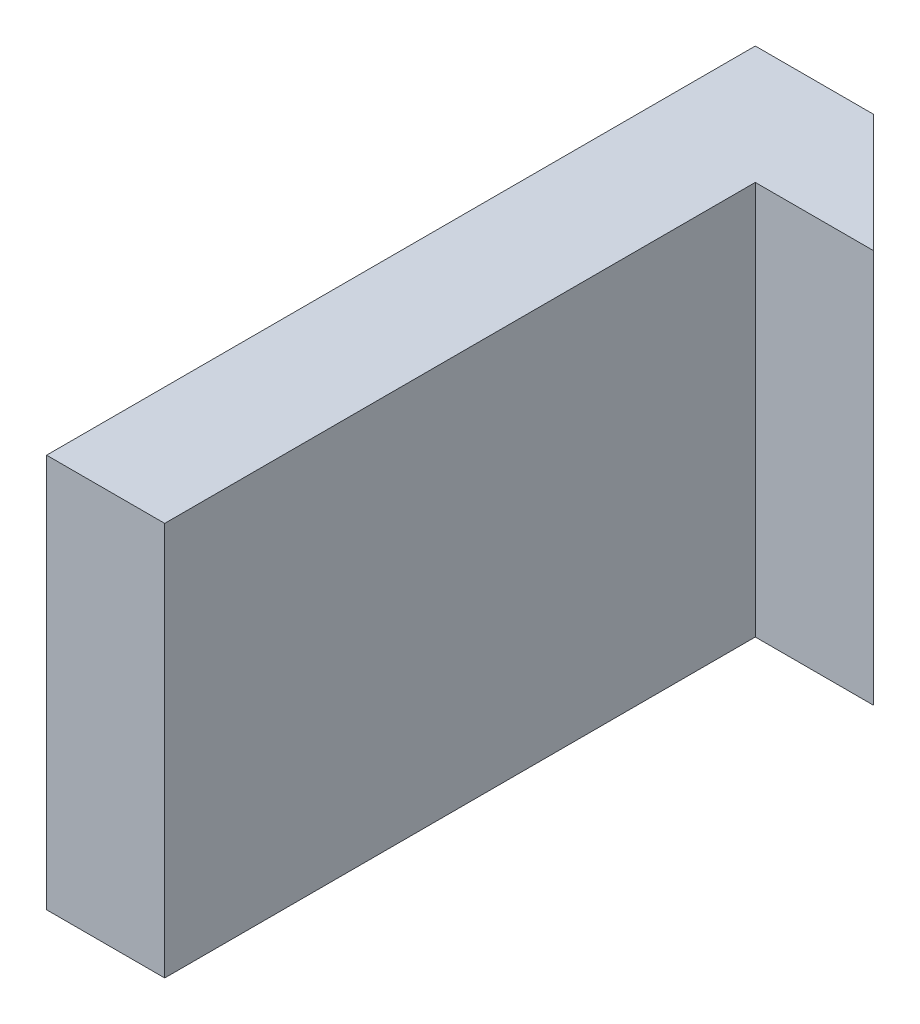
ISO-10303-21;
HEADER;
FILE_DESCRIPTION(('STEP AP214'),'2;1');
FILE_NAME('part.step','',(''),(''),'','','');
FILE_SCHEMA(('AUTOMOTIVE_DESIGN { 1 0 10303 214 1 1 1 1 }'));
ENDSEC;
DATA;
#1=APPLICATION_CONTEXT('core data for automotive mechanical design processes');
#2=APPLICATION_PROTOCOL_DEFINITION('international standard','automotive_design',2000,#1);
#3=PRODUCT_CONTEXT('',#1,'mechanical');
#4=PRODUCT('Part','Part','',(#3));
#5=PRODUCT_RELATED_PRODUCT_CATEGORY('part','',(#4));
#6=PRODUCT_DEFINITION_FORMATION('','',#4);
#7=PRODUCT_DEFINITION_CONTEXT('part definition',#1,'design');
#8=PRODUCT_DEFINITION('design','',#6,#7);
#9=PRODUCT_DEFINITION_SHAPE('','',#8);
#10=(LENGTH_UNIT() NAMED_UNIT(*) SI_UNIT(.MILLI.,.METRE.));
#11=(NAMED_UNIT(*) PLANE_ANGLE_UNIT() SI_UNIT($,.RADIAN.));
#12=(NAMED_UNIT(*) SI_UNIT($,.STERADIAN.) SOLID_ANGLE_UNIT());
#13=UNCERTAINTY_MEASURE_WITH_UNIT(LENGTH_MEASURE(1.E-05),#10,'distance_accuracy_value','');
#14=(GEOMETRIC_REPRESENTATION_CONTEXT(3) GLOBAL_UNCERTAINTY_ASSIGNED_CONTEXT((#13)) GLOBAL_UNIT_ASSIGNED_CONTEXT((#10,
#11,#12)) REPRESENTATION_CONTEXT('',''));
#15=CARTESIAN_POINT('',(0.,0.,0.));
#16=DIRECTION('',(0.,0.,1.));
#17=DIRECTION('',(1.,0.,0.));
#18=AXIS2_PLACEMENT_3D('',#15,#16,#17);
#19=CARTESIAN_POINT('',(0.75,5.,0.));
#20=DIRECTION('',(1.,0.,0.));
#21=DIRECTION('',(0.,0.,-1.));
#22=AXIS2_PLACEMENT_3D('',#19,#20,#21);
#23=PLANE('',#22);
#24=DIRECTION('',(0.,0.,1.));
#25=VECTOR('',#24,1.);
#26=CARTESIAN_POINT('',(0.75,0.,0.));
#27=LINE('',#26,#25);
#28=CARTESIAN_POINT('',(0.749999999999999,0.,-6.));
#29=VERTEX_POINT('',#28);
#30=CARTESIAN_POINT('',(0.75,0.,1.5));
#31=VERTEX_POINT('',#30);
#32=EDGE_CURVE('E115',#29,#31,#27,.T.);
#33=ORIENTED_EDGE('',*,*,#32,.F.);
#34=DIRECTION('',(0.,-1.,0.));
#35=VECTOR('',#34,1.);
#36=CARTESIAN_POINT('',(0.749999999999999,5.,-6.));
#37=LINE('',#36,#35);
#38=CARTESIAN_POINT('',(0.749999999999999,5.,-6.));
#39=VERTEX_POINT('',#38);
#40=EDGE_CURVE('E11',#39,#29,#37,.T.);
#41=ORIENTED_EDGE('',*,*,#40,.F.);
#42=DIRECTION('',(0.,0.,1.));
#43=VECTOR('',#42,1.);
#44=CARTESIAN_POINT('',(0.75,5.,0.));
#45=LINE('',#44,#43);
#46=CARTESIAN_POINT('',(0.75,5.,1.5));
#47=VERTEX_POINT('',#46);
#48=EDGE_CURVE('E127',#39,#47,#45,.T.);
#49=ORIENTED_EDGE('',*,*,#48,.T.);
#50=DIRECTION('',(0.,-1.,0.));
#51=VECTOR('',#50,1.);
#52=CARTESIAN_POINT('',(0.75,5.,1.5));
#53=LINE('',#52,#51);
#54=EDGE_CURVE('E77',#47,#31,#53,.T.);
#55=ORIENTED_EDGE('',*,*,#54,.T.);
#56=EDGE_LOOP('',(#33,#41,#49,#55));
#57=FACE_BOUND('',#56,.T.);
#58=ADVANCED_FACE('F33',(#57),#23,.T.);
#59=CARTESIAN_POINT('',(0.,5.,-6.));
#60=DIRECTION('',(0.,0.,-1.));
#61=DIRECTION('',(-1.,0.,0.));
#62=AXIS2_PLACEMENT_3D('',#59,#60,#61);
#63=PLANE('',#62);
#64=DIRECTION('',(1.,0.,0.));
#65=VECTOR('',#64,1.);
#66=CARTESIAN_POINT('',(0.,0.,-6.));
#67=LINE('',#66,#65);
#68=CARTESIAN_POINT('',(2.25,0.,-6.));
#69=VERTEX_POINT('',#68);
#70=EDGE_CURVE('E118',#29,#69,#67,.T.);
#71=ORIENTED_EDGE('',*,*,#70,.T.);
#72=DIRECTION('',(0.,-1.,0.));
#73=VECTOR('',#72,1.);
#74=CARTESIAN_POINT('',(2.25,5.,-6.));
#75=LINE('',#74,#73);
#76=CARTESIAN_POINT('',(2.25,5.,-6.));
#77=VERTEX_POINT('',#76);
#78=EDGE_CURVE('E41',#77,#69,#75,.T.);
#79=ORIENTED_EDGE('',*,*,#78,.F.);
#80=DIRECTION('',(1.,0.,0.));
#81=VECTOR('',#80,1.);
#82=CARTESIAN_POINT('',(0.,5.,-6.));
#83=LINE('',#82,#81);
#84=EDGE_CURVE('E110',#39,#77,#83,.T.);
#85=ORIENTED_EDGE('',*,*,#84,.F.);
#86=ORIENTED_EDGE('',*,*,#40,.T.);
#87=EDGE_LOOP('',(#71,#79,#85,#86));
#88=FACE_BOUND('',#87,.T.);
#89=ADVANCED_FACE('F143',(#88),#63,.F.);
#90=CARTESIAN_POINT('',(4.125,5.,-4.125));
#91=DIRECTION('',(-0.707106781186548,0.,0.707106781186548));
#92=DIRECTION('',(0.707106781186548,0.,0.707106781186548));
#93=AXIS2_PLACEMENT_3D('',#90,#91,#92);
#94=PLANE('',#93);
#95=DIRECTION('',(-0.707106781186548,0.,-0.707106781186548));
#96=VECTOR('',#95,1.);
#97=CARTESIAN_POINT('',(4.125,0.,-4.125));
#98=LINE('',#97,#96);
#99=CARTESIAN_POINT('',(0.75,0.,-7.5));
#100=VERTEX_POINT('',#99);
#101=EDGE_CURVE('E120',#69,#100,#98,.T.);
#102=ORIENTED_EDGE('',*,*,#101,.T.);
#103=DIRECTION('',(0.,-1.,0.));
#104=VECTOR('',#103,1.);
#105=CARTESIAN_POINT('',(0.75,5.,-7.5));
#106=LINE('',#105,#104);
#107=CARTESIAN_POINT('',(0.75,5.,-7.5));
#108=VERTEX_POINT('',#107);
#109=EDGE_CURVE('E99',#108,#100,#106,.T.);
#110=ORIENTED_EDGE('',*,*,#109,.F.);
#111=DIRECTION('',(-0.707106781186548,0.,-0.707106781186548));
#112=VECTOR('',#111,1.);
#113=CARTESIAN_POINT('',(4.125,5.,-4.125));
#114=LINE('',#113,#112);
#115=EDGE_CURVE('E107',#77,#108,#114,.T.);
#116=ORIENTED_EDGE('',*,*,#115,.F.);
#117=ORIENTED_EDGE('',*,*,#78,.T.);
#118=EDGE_LOOP('',(#102,#110,#116,#117));
#119=FACE_BOUND('',#118,.T.);
#120=ADVANCED_FACE('F134',(#119),#94,.F.);
#121=CARTESIAN_POINT('',(0.,5.,-7.5));
#122=DIRECTION('',(0.,0.,-1.));
#123=DIRECTION('',(-1.,0.,0.));
#124=AXIS2_PLACEMENT_3D('',#121,#122,#123);
#125=PLANE('',#124);
#126=DIRECTION('',(1.,0.,0.));
#127=VECTOR('',#126,1.);
#128=CARTESIAN_POINT('',(0.,0.,-7.5));
#129=LINE('',#128,#127);
#130=CARTESIAN_POINT('',(-0.750000000000001,0.,-7.5));
#131=VERTEX_POINT('',#130);
#132=EDGE_CURVE('E98',#131,#100,#129,.T.);
#133=ORIENTED_EDGE('',*,*,#132,.F.);
#134=DIRECTION('',(0.,-1.,0.));
#135=VECTOR('',#134,1.);
#136=CARTESIAN_POINT('',(-0.750000000000001,5.,-7.5));
#137=LINE('',#136,#135);
#138=CARTESIAN_POINT('',(-0.750000000000001,5.,-7.5));
#139=VERTEX_POINT('',#138);
#140=EDGE_CURVE('E92',#139,#131,#137,.T.);
#141=ORIENTED_EDGE('',*,*,#140,.F.);
#142=DIRECTION('',(1.,0.,0.));
#143=VECTOR('',#142,1.);
#144=CARTESIAN_POINT('',(0.,5.,-7.5));
#145=LINE('',#144,#143);
#146=EDGE_CURVE('E96',#139,#108,#145,.T.);
#147=ORIENTED_EDGE('',*,*,#146,.T.);
#148=ORIENTED_EDGE('',*,*,#109,.T.);
#149=EDGE_LOOP('',(#133,#141,#147,#148));
#150=FACE_BOUND('',#149,.T.);
#151=ADVANCED_FACE('F94',(#150),#125,.T.);
#152=CARTESIAN_POINT('',(-0.75,5.,0.));
#153=DIRECTION('',(1.,0.,0.));
#154=DIRECTION('',(0.,0.,-1.));
#155=AXIS2_PLACEMENT_3D('',#152,#153,#154);
#156=PLANE('',#155);
#157=DIRECTION('',(0.,0.,1.));
#158=VECTOR('',#157,1.);
#159=CARTESIAN_POINT('',(-0.75,0.,0.));
#160=LINE('',#159,#158);
#161=CARTESIAN_POINT('',(-0.75,0.,1.5));
#162=VERTEX_POINT('',#161);
#163=EDGE_CURVE('E70',#131,#162,#160,.T.);
#164=ORIENTED_EDGE('',*,*,#163,.T.);
#165=DIRECTION('',(0.,-1.,0.));
#166=VECTOR('',#165,1.);
#167=CARTESIAN_POINT('',(-0.75,5.,1.5));
#168=LINE('',#167,#166);
#169=CARTESIAN_POINT('',(-0.75,5.,1.5));
#170=VERTEX_POINT('',#169);
#171=EDGE_CURVE('E100',#170,#162,#168,.T.);
#172=ORIENTED_EDGE('',*,*,#171,.F.);
#173=DIRECTION('',(0.,0.,1.));
#174=VECTOR('',#173,1.);
#175=CARTESIAN_POINT('',(-0.75,5.,0.));
#176=LINE('',#175,#174);
#177=EDGE_CURVE('E102',#139,#170,#176,.T.);
#178=ORIENTED_EDGE('',*,*,#177,.F.);
#179=ORIENTED_EDGE('',*,*,#140,.T.);
#180=EDGE_LOOP('',(#164,#172,#178,#179));
#181=FACE_BOUND('',#180,.T.);
#182=ADVANCED_FACE('F103',(#181),#156,.F.);
#183=CARTESIAN_POINT('',(0.,5.,1.5));
#184=DIRECTION('',(0.,0.,-1.));
#185=DIRECTION('',(-1.,0.,0.));
#186=AXIS2_PLACEMENT_3D('',#183,#184,#185);
#187=PLANE('',#186);
#188=DIRECTION('',(1.,0.,0.));
#189=VECTOR('',#188,1.);
#190=CARTESIAN_POINT('',(0.,0.,1.5));
#191=LINE('',#190,#189);
#192=EDGE_CURVE('E125',#162,#31,#191,.T.);
#193=ORIENTED_EDGE('',*,*,#192,.T.);
#194=ORIENTED_EDGE('',*,*,#54,.F.);
#195=DIRECTION('',(1.,0.,0.));
#196=VECTOR('',#195,1.);
#197=CARTESIAN_POINT('',(0.,5.,1.5));
#198=LINE('',#197,#196);
#199=EDGE_CURVE('E49',#170,#47,#198,.T.);
#200=ORIENTED_EDGE('',*,*,#199,.F.);
#201=ORIENTED_EDGE('',*,*,#171,.T.);
#202=EDGE_LOOP('',(#193,#194,#200,#201));
#203=FACE_BOUND('',#202,.T.);
#204=ADVANCED_FACE('F141',(#203),#187,.F.);
#205=CARTESIAN_POINT('',(0.,5.,0.));
#206=DIRECTION('',(0.,1.,0.));
#207=DIRECTION('',(0.,0.,1.));
#208=AXIS2_PLACEMENT_3D('',#205,#206,#207);
#209=PLANE('',#208);
#210=ORIENTED_EDGE('',*,*,#48,.F.);
#211=ORIENTED_EDGE('',*,*,#84,.T.);
#212=ORIENTED_EDGE('',*,*,#115,.T.);
#213=ORIENTED_EDGE('',*,*,#146,.F.);
#214=ORIENTED_EDGE('',*,*,#177,.T.);
#215=ORIENTED_EDGE('',*,*,#199,.T.);
#216=EDGE_LOOP('',(#210,#211,#212,#213,#214,#215));
#217=FACE_BOUND('',#216,.T.);
#218=ADVANCED_FACE('F105',(#217),#209,.T.);
#219=CARTESIAN_POINT('',(0.,0.,0.));
#220=DIRECTION('',(0.,1.,0.));
#221=DIRECTION('',(0.,0.,1.));
#222=AXIS2_PLACEMENT_3D('',#219,#220,#221);
#223=PLANE('',#222);
#224=ORIENTED_EDGE('',*,*,#32,.T.);
#225=ORIENTED_EDGE('',*,*,#192,.F.);
#226=ORIENTED_EDGE('',*,*,#163,.F.);
#227=ORIENTED_EDGE('',*,*,#132,.T.);
#228=ORIENTED_EDGE('',*,*,#101,.F.);
#229=ORIENTED_EDGE('',*,*,#70,.F.);
#230=EDGE_LOOP('',(#224,#225,#226,#227,#228,#229));
#231=FACE_BOUND('',#230,.T.);
#232=ADVANCED_FACE('F138',(#231),#223,.F.);
#233=CLOSED_SHELL('',(#58,#89,#120,#151,#182,#204,#218,#232));
#234=MANIFOLD_SOLID_BREP('B2',#233);
#235=ADVANCED_BREP_SHAPE_REPRESENTATION('',(#18,#234),#14);
#236=SHAPE_DEFINITION_REPRESENTATION(#9,#235);
ENDSEC;
END-ISO-10303-21;
